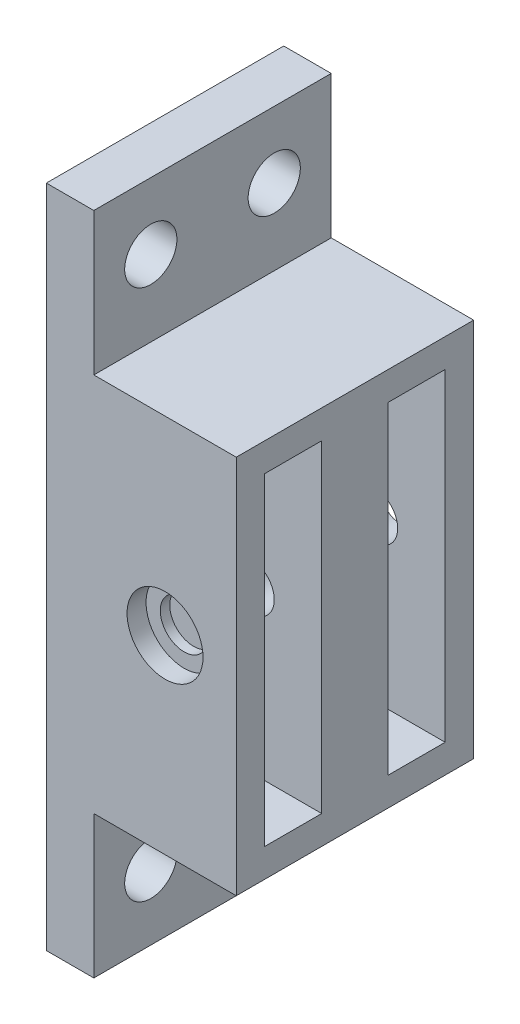
ISO-10303-21;
HEADER;
FILE_DESCRIPTION(('STEP AP214'),'2;1');
FILE_NAME('part.step','',(''),(''),'','','');
FILE_SCHEMA(('AUTOMOTIVE_DESIGN { 1 0 10303 214 1 1 1 1 }'));
ENDSEC;
DATA;
#1=APPLICATION_CONTEXT('core data for automotive mechanical design processes');
#2=APPLICATION_PROTOCOL_DEFINITION('international standard','automotive_design',2000,#1);
#3=PRODUCT_CONTEXT('',#1,'mechanical');
#4=PRODUCT('Part','Part','',(#3));
#5=PRODUCT_RELATED_PRODUCT_CATEGORY('part','',(#4));
#6=PRODUCT_DEFINITION_FORMATION('','',#4);
#7=PRODUCT_DEFINITION_CONTEXT('part definition',#1,'design');
#8=PRODUCT_DEFINITION('design','',#6,#7);
#9=PRODUCT_DEFINITION_SHAPE('','',#8);
#10=(LENGTH_UNIT() NAMED_UNIT(*) SI_UNIT(.MILLI.,.METRE.));
#11=(NAMED_UNIT(*) PLANE_ANGLE_UNIT() SI_UNIT($,.RADIAN.));
#12=(NAMED_UNIT(*) SI_UNIT($,.STERADIAN.) SOLID_ANGLE_UNIT());
#13=UNCERTAINTY_MEASURE_WITH_UNIT(LENGTH_MEASURE(1.E-05),#10,'distance_accuracy_value','');
#14=(GEOMETRIC_REPRESENTATION_CONTEXT(3) GLOBAL_UNCERTAINTY_ASSIGNED_CONTEXT((#13)) GLOBAL_UNIT_ASSIGNED_CONTEXT((#10,
#11,#12)) REPRESENTATION_CONTEXT('',''));
#15=CARTESIAN_POINT('',(0.,0.,0.));
#16=DIRECTION('',(0.,0.,1.));
#17=DIRECTION('',(1.,0.,0.));
#18=AXIS2_PLACEMENT_3D('',#15,#16,#17);
#19=CARTESIAN_POINT('',(5.,0.,0.));
#20=DIRECTION('',(1.,0.,0.));
#21=DIRECTION('',(0.,0.,-1.));
#22=AXIS2_PLACEMENT_3D('',#19,#20,#21);
#23=PLANE('',#22);
#24=DIRECTION('',(0.,0.,1.));
#25=VECTOR('',#24,1.);
#26=CARTESIAN_POINT('',(5.,36.3888036859797,-20.3200373764248));
#27=LINE('',#26,#25);
#28=CARTESIAN_POINT('',(5.,36.3888036859797,-45.3200373764248));
#29=VERTEX_POINT('',#28);
#30=CARTESIAN_POINT('',(5.,36.3888036859797,-20.3200373764248));
#31=VERTEX_POINT('',#30);
#32=EDGE_CURVE('E262',#29,#31,#27,.T.);
#33=ORIENTED_EDGE('',*,*,#32,.F.);
#34=DIRECTION('',(0.,1.,0.));
#35=VECTOR('',#34,1.);
#36=CARTESIAN_POINT('',(5.,51.3888036859797,-45.3200373764248));
#37=LINE('',#36,#35);
#38=CARTESIAN_POINT('',(5.,51.3888036859797,-45.3200373764248));
#39=VERTEX_POINT('',#38);
#40=EDGE_CURVE('E335',#29,#39,#37,.T.);
#41=ORIENTED_EDGE('',*,*,#40,.T.);
#42=DIRECTION('',(0.,0.,1.));
#43=VECTOR('',#42,1.);
#44=CARTESIAN_POINT('',(5.,51.3888036859797,-20.3200373764248));
#45=LINE('',#44,#43);
#46=CARTESIAN_POINT('',(5.,51.3888036859797,-20.3200373764248));
#47=VERTEX_POINT('',#46);
#48=EDGE_CURVE('E332',#39,#47,#45,.T.);
#49=ORIENTED_EDGE('',*,*,#48,.T.);
#50=DIRECTION('',(0.,-1.,0.));
#51=VECTOR('',#50,1.);
#52=CARTESIAN_POINT('',(5.,51.3888036859797,-20.3200373764248));
#53=LINE('',#52,#51);
#54=EDGE_CURVE('E337',#47,#31,#53,.T.);
#55=ORIENTED_EDGE('',*,*,#54,.T.);
#56=EDGE_LOOP('',(#33,#41,#49,#55));
#57=FACE_BOUND('',#56,.T.);
#58=CARTESIAN_POINT('',(5.,44.3888036859797,-39.3200373764248));
#59=DIRECTION('',(1.,0.,0.));
#60=DIRECTION('',(0.,0.,-1.));
#61=AXIS2_PLACEMENT_3D('',#58,#59,#60);
#62=CIRCLE('',#61,2.75);
#63=CARTESIAN_POINT('',(5.,44.3888036859797,-42.0700373764248));
#64=VERTEX_POINT('',#63);
#65=EDGE_CURVE('E315',#64,#64,#62,.T.);
#66=ORIENTED_EDGE('',*,*,#65,.F.);
#67=EDGE_LOOP('',(#66));
#68=FACE_BOUND('',#67,.T.);
#69=CARTESIAN_POINT('',(5.,44.3888036859797,-26.3200373764248));
#70=DIRECTION('',(1.,0.,0.));
#71=DIRECTION('',(0.,0.,-1.));
#72=AXIS2_PLACEMENT_3D('',#69,#70,#71);
#73=CIRCLE('',#72,2.75);
#74=CARTESIAN_POINT('',(5.,44.3888036859797,-29.0700373764248));
#75=VERTEX_POINT('',#74);
#76=EDGE_CURVE('E319',#75,#75,#73,.T.);
#77=ORIENTED_EDGE('',*,*,#76,.F.);
#78=EDGE_LOOP('',(#77));
#79=FACE_BOUND('',#78,.T.);
#80=ADVANCED_FACE('F44',(#57,#68,#79),#23,.T.);
#81=DIRECTION('',(0.,0.,-1.));
#82=VECTOR('',#81,1.);
#83=CARTESIAN_POINT('',(5.,-3.61119631402033,-20.3200373764248));
#84=LINE('',#83,#82);
#85=CARTESIAN_POINT('',(5.,-3.61119631402033,-20.3200373764248));
#86=VERTEX_POINT('',#85);
#87=CARTESIAN_POINT('',(5.,-3.61119631402033,-45.3200373764248));
#88=VERTEX_POINT('',#87);
#89=EDGE_CURVE('E211',#86,#88,#84,.T.);
#90=ORIENTED_EDGE('',*,*,#89,.F.);
#91=CARTESIAN_POINT('',(5.,-18.6111963140203,-20.3200373764248));
#92=VERTEX_POINT('',#91);
#93=EDGE_CURVE('E333',#86,#92,#53,.T.);
#94=ORIENTED_EDGE('',*,*,#93,.T.);
#95=DIRECTION('',(0.,0.,-1.));
#96=VECTOR('',#95,1.);
#97=CARTESIAN_POINT('',(5.,-18.6111963140203,-20.3200373764248));
#98=LINE('',#97,#96);
#99=CARTESIAN_POINT('',(5.,-18.6111963140203,-45.3200373764248));
#100=VERTEX_POINT('',#99);
#101=EDGE_CURVE('E336',#92,#100,#98,.T.);
#102=ORIENTED_EDGE('',*,*,#101,.T.);
#103=EDGE_CURVE('E327',#100,#88,#37,.T.);
#104=ORIENTED_EDGE('',*,*,#103,.T.);
#105=EDGE_LOOP('',(#90,#94,#102,#104));
#106=FACE_BOUND('',#105,.T.);
#107=CARTESIAN_POINT('',(5.,-11.6111963140203,-26.3200373764248));
#108=DIRECTION('',(1.,0.,0.));
#109=DIRECTION('',(0.,0.,-1.));
#110=AXIS2_PLACEMENT_3D('',#107,#108,#109);
#111=CIRCLE('',#110,2.74999999999999);
#112=CARTESIAN_POINT('',(5.,-11.6111963140203,-29.0700373764248));
#113=VERTEX_POINT('',#112);
#114=EDGE_CURVE('E302',#113,#113,#111,.T.);
#115=ORIENTED_EDGE('',*,*,#114,.F.);
#116=EDGE_LOOP('',(#115));
#117=FACE_BOUND('',#116,.T.);
#118=CARTESIAN_POINT('',(5.,-11.6111963140203,-39.3200373764248));
#119=DIRECTION('',(1.,0.,0.));
#120=DIRECTION('',(0.,0.,-1.));
#121=AXIS2_PLACEMENT_3D('',#118,#119,#120);
#122=CIRCLE('',#121,2.74999999999999);
#123=CARTESIAN_POINT('',(5.,-11.6111963140203,-42.0700373764248));
#124=VERTEX_POINT('',#123);
#125=EDGE_CURVE('E297',#124,#124,#122,.T.);
#126=ORIENTED_EDGE('',*,*,#125,.F.);
#127=EDGE_LOOP('',(#126));
#128=FACE_BOUND('',#127,.T.);
#129=ADVANCED_FACE('F387',(#106,#117,#128),#23,.T.);
#130=CARTESIAN_POINT('',(0.,0.,0.));
#131=DIRECTION('',(1.,0.,0.));
#132=DIRECTION('',(0.,0.,-1.));
#133=AXIS2_PLACEMENT_3D('',#130,#131,#132);
#134=PLANE('',#133);
#135=DIRECTION('',(0.,0.,1.));
#136=VECTOR('',#135,1.);
#137=CARTESIAN_POINT('',(0.,33.3888036859797,-23.3200373764248));
#138=LINE('',#137,#136);
#139=CARTESIAN_POINT('',(0.,33.3888036859797,-29.3200373764248));
#140=VERTEX_POINT('',#139);
#141=CARTESIAN_POINT('',(0.,33.3888036859797,-23.3200373764248));
#142=VERTEX_POINT('',#141);
#143=EDGE_CURVE('E174',#140,#142,#138,.T.);
#144=ORIENTED_EDGE('',*,*,#143,.T.);
#145=DIRECTION('',(0.,-1.,0.));
#146=VECTOR('',#145,1.);
#147=CARTESIAN_POINT('',(0.,33.3888036859797,-23.3200373764248));
#148=LINE('',#147,#146);
#149=CARTESIAN_POINT('',(0.,-0.611196314020332,-23.3200373764248));
#150=VERTEX_POINT('',#149);
#151=EDGE_CURVE('E163',#142,#150,#148,.T.);
#152=ORIENTED_EDGE('',*,*,#151,.T.);
#153=DIRECTION('',(0.,0.,-1.));
#154=VECTOR('',#153,1.);
#155=CARTESIAN_POINT('',(0.,-0.611196314020332,-23.3200373764248));
#156=LINE('',#155,#154);
#157=CARTESIAN_POINT('',(0.,-0.611196314020332,-29.3200373764248));
#158=VERTEX_POINT('',#157);
#159=EDGE_CURVE('E178',#150,#158,#156,.T.);
#160=ORIENTED_EDGE('',*,*,#159,.T.);
#161=DIRECTION('',(0.,1.,0.));
#162=VECTOR('',#161,1.);
#163=CARTESIAN_POINT('',(0.,33.3888036859797,-29.3200373764248));
#164=LINE('',#163,#162);
#165=EDGE_CURVE('E65',#158,#140,#164,.T.);
#166=ORIENTED_EDGE('',*,*,#165,.T.);
#167=EDGE_LOOP('',(#144,#152,#160,#166));
#168=FACE_BOUND('',#167,.T.);
#169=DIRECTION('',(0.,0.,1.));
#170=VECTOR('',#169,1.);
#171=CARTESIAN_POINT('',(0.,33.3888036859797,-36.3200373764248));
#172=LINE('',#171,#170);
#173=CARTESIAN_POINT('',(0.,33.3888036859797,-42.3200373764248));
#174=VERTEX_POINT('',#173);
#175=CARTESIAN_POINT('',(0.,33.3888036859797,-36.3200373764248));
#176=VERTEX_POINT('',#175);
#177=EDGE_CURVE('E222',#174,#176,#172,.T.);
#178=ORIENTED_EDGE('',*,*,#177,.T.);
#179=DIRECTION('',(0.,-1.,0.));
#180=VECTOR('',#179,1.);
#181=CARTESIAN_POINT('',(0.,33.3888036859797,-36.3200373764248));
#182=LINE('',#181,#180);
#183=CARTESIAN_POINT('',(0.,-0.611196314020332,-36.3200373764248));
#184=VERTEX_POINT('',#183);
#185=EDGE_CURVE('E240',#176,#184,#182,.T.);
#186=ORIENTED_EDGE('',*,*,#185,.T.);
#187=DIRECTION('',(0.,0.,-1.));
#188=VECTOR('',#187,1.);
#189=CARTESIAN_POINT('',(0.,-0.611196314020332,-36.3200373764248));
#190=LINE('',#189,#188);
#191=CARTESIAN_POINT('',(0.,-0.611196314020332,-42.3200373764248));
#192=VERTEX_POINT('',#191);
#193=EDGE_CURVE('E252',#184,#192,#190,.T.);
#194=ORIENTED_EDGE('',*,*,#193,.T.);
#195=DIRECTION('',(0.,1.,0.));
#196=VECTOR('',#195,1.);
#197=CARTESIAN_POINT('',(0.,33.3888036859797,-42.3200373764248));
#198=LINE('',#197,#196);
#199=EDGE_CURVE('E69',#192,#174,#198,.T.);
#200=ORIENTED_EDGE('',*,*,#199,.T.);
#201=EDGE_LOOP('',(#178,#186,#194,#200));
#202=FACE_BOUND('',#201,.T.);
#203=DIRECTION('',(0.,1.,0.));
#204=VECTOR('',#203,1.);
#205=CARTESIAN_POINT('',(0.,51.3888036859797,-45.3200373764248));
#206=LINE('',#205,#204);
#207=CARTESIAN_POINT('',(0.,-18.6111963140203,-45.3200373764248));
#208=VERTEX_POINT('',#207);
#209=CARTESIAN_POINT('',(0.,51.3888036859797,-45.3200373764248));
#210=VERTEX_POINT('',#209);
#211=EDGE_CURVE('E322',#208,#210,#206,.T.);
#212=ORIENTED_EDGE('',*,*,#211,.F.);
#213=DIRECTION('',(0.,0.,-1.));
#214=VECTOR('',#213,1.);
#215=CARTESIAN_POINT('',(0.,-18.6111963140203,-20.3200373764248));
#216=LINE('',#215,#214);
#217=CARTESIAN_POINT('',(0.,-18.6111963140203,-20.3200373764248));
#218=VERTEX_POINT('',#217);
#219=EDGE_CURVE('E355',#218,#208,#216,.T.);
#220=ORIENTED_EDGE('',*,*,#219,.F.);
#221=DIRECTION('',(0.,-1.,0.));
#222=VECTOR('',#221,1.);
#223=CARTESIAN_POINT('',(0.,51.3888036859797,-20.3200373764248));
#224=LINE('',#223,#222);
#225=CARTESIAN_POINT('',(0.,51.3888036859797,-20.3200373764248));
#226=VERTEX_POINT('',#225);
#227=EDGE_CURVE('E349',#226,#218,#224,.T.);
#228=ORIENTED_EDGE('',*,*,#227,.F.);
#229=DIRECTION('',(0.,0.,1.));
#230=VECTOR('',#229,1.);
#231=CARTESIAN_POINT('',(0.,51.3888036859797,-20.3200373764248));
#232=LINE('',#231,#230);
#233=EDGE_CURVE('E347',#210,#226,#232,.T.);
#234=ORIENTED_EDGE('',*,*,#233,.F.);
#235=EDGE_LOOP('',(#212,#220,#228,#234));
#236=FACE_BOUND('',#235,.T.);
#237=CARTESIAN_POINT('',(0.,44.3888036859797,-26.3200373764248));
#238=DIRECTION('',(1.,0.,0.));
#239=DIRECTION('',(0.,0.,-1.));
#240=AXIS2_PLACEMENT_3D('',#237,#238,#239);
#241=CIRCLE('',#240,2.75);
#242=CARTESIAN_POINT('',(0.,44.3888036859797,-29.0700373764248));
#243=VERTEX_POINT('',#242);
#244=EDGE_CURVE('E316',#243,#243,#241,.T.);
#245=ORIENTED_EDGE('',*,*,#244,.T.);
#246=EDGE_LOOP('',(#245));
#247=FACE_BOUND('',#246,.T.);
#248=CARTESIAN_POINT('',(0.,44.3888036859797,-39.3200373764248));
#249=DIRECTION('',(1.,0.,0.));
#250=DIRECTION('',(0.,0.,-1.));
#251=AXIS2_PLACEMENT_3D('',#248,#249,#250);
#252=CIRCLE('',#251,2.75);
#253=CARTESIAN_POINT('',(0.,44.3888036859797,-42.0700373764248));
#254=VERTEX_POINT('',#253);
#255=EDGE_CURVE('E306',#254,#254,#252,.T.);
#256=ORIENTED_EDGE('',*,*,#255,.T.);
#257=EDGE_LOOP('',(#256));
#258=FACE_BOUND('',#257,.T.);
#259=CARTESIAN_POINT('',(0.,-11.6111963140203,-26.3200373764248));
#260=DIRECTION('',(1.,0.,0.));
#261=DIRECTION('',(0.,0.,-1.));
#262=AXIS2_PLACEMENT_3D('',#259,#260,#261);
#263=CIRCLE('',#262,2.74999999999999);
#264=CARTESIAN_POINT('',(0.,-11.6111963140203,-29.0700373764248));
#265=VERTEX_POINT('',#264);
#266=EDGE_CURVE('E298',#265,#265,#263,.T.);
#267=ORIENTED_EDGE('',*,*,#266,.T.);
#268=EDGE_LOOP('',(#267));
#269=FACE_BOUND('',#268,.T.);
#270=CARTESIAN_POINT('',(0.,-11.6111963140203,-39.3200373764248));
#271=DIRECTION('',(1.,0.,0.));
#272=DIRECTION('',(0.,0.,-1.));
#273=AXIS2_PLACEMENT_3D('',#270,#271,#272);
#274=CIRCLE('',#273,2.74999999999999);
#275=CARTESIAN_POINT('',(0.,-11.6111963140203,-42.0700373764248));
#276=VERTEX_POINT('',#275);
#277=EDGE_CURVE('E293',#276,#276,#274,.T.);
#278=ORIENTED_EDGE('',*,*,#277,.T.);
#279=EDGE_LOOP('',(#278));
#280=FACE_BOUND('',#279,.T.);
#281=ADVANCED_FACE('F182',(#168,#202,#236,#247,#258,#269,#280),#134,.F.);
#282=CARTESIAN_POINT('',(5.,51.3888036859797,-45.3200373764248));
#283=DIRECTION('',(0.,0.,1.));
#284=DIRECTION('',(0.,-1.,0.));
#285=AXIS2_PLACEMENT_3D('',#282,#283,#284);
#286=PLANE('',#285);
#287=CARTESIAN_POINT('',(12.5,16.3888036859797,-45.3200373764248));
#288=DIRECTION('',(0.,0.,1.));
#289=DIRECTION('',(1.,0.,0.));
#290=AXIS2_PLACEMENT_3D('',#287,#288,#289);
#291=CIRCLE('',#290,2.5);
#292=CARTESIAN_POINT('',(15.,16.3888036859797,-45.3200373764248));
#293=VERTEX_POINT('',#292);
#294=EDGE_CURVE('E513',#293,#293,#291,.T.);
#295=ORIENTED_EDGE('',*,*,#294,.T.);
#296=EDGE_LOOP('',(#295));
#297=FACE_BOUND('',#296,.T.);
#298=ORIENTED_EDGE('',*,*,#211,.T.);
#299=DIRECTION('',(-1.,0.,0.));
#300=VECTOR('',#299,1.);
#301=CARTESIAN_POINT('',(5.,51.3888036859797,-45.3200373764248));
#302=LINE('',#301,#300);
#303=EDGE_CURVE('E11',#39,#210,#302,.T.);
#304=ORIENTED_EDGE('',*,*,#303,.F.);
#305=ORIENTED_EDGE('',*,*,#40,.F.);
#306=DIRECTION('',(-1.,0.,0.));
#307=VECTOR('',#306,1.);
#308=CARTESIAN_POINT('',(20.,36.3888036859797,-45.3200373764248));
#309=LINE('',#308,#307);
#310=CARTESIAN_POINT('',(20.,36.3888036859797,-45.3200373764248));
#311=VERTEX_POINT('',#310);
#312=EDGE_CURVE('E284',#311,#29,#309,.T.);
#313=ORIENTED_EDGE('',*,*,#312,.F.);
#314=DIRECTION('',(0.,1.,0.));
#315=VECTOR('',#314,1.);
#316=CARTESIAN_POINT('',(20.,36.3888036859797,-45.3200373764248));
#317=LINE('',#316,#315);
#318=CARTESIAN_POINT('',(20.,-3.61119631402033,-45.3200373764248));
#319=VERTEX_POINT('',#318);
#320=EDGE_CURVE('E270',#319,#311,#317,.T.);
#321=ORIENTED_EDGE('',*,*,#320,.F.);
#322=DIRECTION('',(-1.,0.,0.));
#323=VECTOR('',#322,1.);
#324=CARTESIAN_POINT('',(20.,-3.61119631402033,-45.3200373764248));
#325=LINE('',#324,#323);
#326=EDGE_CURVE('E290',#319,#88,#325,.T.);
#327=ORIENTED_EDGE('',*,*,#326,.T.);
#328=ORIENTED_EDGE('',*,*,#103,.F.);
#329=DIRECTION('',(-1.,0.,0.));
#330=VECTOR('',#329,1.);
#331=CARTESIAN_POINT('',(5.,-18.6111963140203,-45.3200373764248));
#332=LINE('',#331,#330);
#333=EDGE_CURVE('E345',#100,#208,#332,.T.);
#334=ORIENTED_EDGE('',*,*,#333,.T.);
#335=EDGE_LOOP('',(#298,#304,#305,#313,#321,#327,#328,#334));
#336=FACE_BOUND('',#335,.T.);
#337=ADVANCED_FACE('F50',(#297,#336),#286,.F.);
#338=CARTESIAN_POINT('',(5.,51.3888036859797,-20.3200373764248));
#339=DIRECTION('',(0.,-1.,0.));
#340=DIRECTION('',(0.,0.,-1.));
#341=AXIS2_PLACEMENT_3D('',#338,#339,#340);
#342=PLANE('',#341);
#343=ORIENTED_EDGE('',*,*,#233,.T.);
#344=DIRECTION('',(-1.,0.,0.));
#345=VECTOR('',#344,1.);
#346=CARTESIAN_POINT('',(5.,51.3888036859797,-20.3200373764248));
#347=LINE('',#346,#345);
#348=EDGE_CURVE('E54',#47,#226,#347,.T.);
#349=ORIENTED_EDGE('',*,*,#348,.F.);
#350=ORIENTED_EDGE('',*,*,#48,.F.);
#351=ORIENTED_EDGE('',*,*,#303,.T.);
#352=EDGE_LOOP('',(#343,#349,#350,#351));
#353=FACE_BOUND('',#352,.T.);
#354=ADVANCED_FACE('F397',(#353),#342,.F.);
#355=CARTESIAN_POINT('',(5.,51.3888036859797,-20.3200373764248));
#356=DIRECTION('',(0.,0.,-1.));
#357=DIRECTION('',(0.,1.,0.));
#358=AXIS2_PLACEMENT_3D('',#355,#356,#357);
#359=PLANE('',#358);
#360=CARTESIAN_POINT('',(12.5,16.3888036859797,-20.3200373764248));
#361=DIRECTION('',(0.,0.,1.));
#362=DIRECTION('',(1.,0.,0.));
#363=AXIS2_PLACEMENT_3D('',#360,#361,#362);
#364=CIRCLE('',#363,4.);
#365=CARTESIAN_POINT('',(16.5,16.3888036859797,-20.3200373764248));
#366=VERTEX_POINT('',#365);
#367=EDGE_CURVE('E195',#366,#366,#364,.T.);
#368=ORIENTED_EDGE('',*,*,#367,.F.);
#369=EDGE_LOOP('',(#368));
#370=FACE_BOUND('',#369,.T.);
#371=ORIENTED_EDGE('',*,*,#227,.T.);
#372=DIRECTION('',(-1.,0.,0.));
#373=VECTOR('',#372,1.);
#374=CARTESIAN_POINT('',(5.,-18.6111963140203,-20.3200373764248));
#375=LINE('',#374,#373);
#376=EDGE_CURVE('E356',#92,#218,#375,.T.);
#377=ORIENTED_EDGE('',*,*,#376,.F.);
#378=ORIENTED_EDGE('',*,*,#93,.F.);
#379=DIRECTION('',(-1.,0.,0.));
#380=VECTOR('',#379,1.);
#381=CARTESIAN_POINT('',(20.,-3.61119631402033,-20.3200373764248));
#382=LINE('',#381,#380);
#383=CARTESIAN_POINT('',(20.,-3.61119631402033,-20.3200373764248));
#384=VERTEX_POINT('',#383);
#385=EDGE_CURVE('E292',#384,#86,#382,.T.);
#386=ORIENTED_EDGE('',*,*,#385,.F.);
#387=DIRECTION('',(0.,-1.,0.));
#388=VECTOR('',#387,1.);
#389=CARTESIAN_POINT('',(20.,36.3888036859797,-20.3200373764248));
#390=LINE('',#389,#388);
#391=CARTESIAN_POINT('',(20.,36.3888036859797,-20.3200373764248));
#392=VERTEX_POINT('',#391);
#393=EDGE_CURVE('E259',#392,#384,#390,.T.);
#394=ORIENTED_EDGE('',*,*,#393,.F.);
#395=DIRECTION('',(-1.,0.,0.));
#396=VECTOR('',#395,1.);
#397=CARTESIAN_POINT('',(20.,36.3888036859797,-20.3200373764248));
#398=LINE('',#397,#396);
#399=EDGE_CURVE('E272',#392,#31,#398,.T.);
#400=ORIENTED_EDGE('',*,*,#399,.T.);
#401=ORIENTED_EDGE('',*,*,#54,.F.);
#402=ORIENTED_EDGE('',*,*,#348,.T.);
#403=EDGE_LOOP('',(#371,#377,#378,#386,#394,#400,#401,#402));
#404=FACE_BOUND('',#403,.T.);
#405=ADVANCED_FACE('F366',(#370,#404),#359,.F.);
#406=CARTESIAN_POINT('',(5.,-18.6111963140203,-20.3200373764248));
#407=DIRECTION('',(0.,1.,0.));
#408=DIRECTION('',(0.,0.,1.));
#409=AXIS2_PLACEMENT_3D('',#406,#407,#408);
#410=PLANE('',#409);
#411=ORIENTED_EDGE('',*,*,#219,.T.);
#412=ORIENTED_EDGE('',*,*,#333,.F.);
#413=ORIENTED_EDGE('',*,*,#101,.F.);
#414=ORIENTED_EDGE('',*,*,#376,.T.);
#415=EDGE_LOOP('',(#411,#412,#413,#414));
#416=FACE_BOUND('',#415,.T.);
#417=ADVANCED_FACE('F378',(#416),#410,.F.);
#418=CARTESIAN_POINT('',(5.,44.3888036859797,-26.3200373764248));
#419=DIRECTION('',(-1.,0.,0.));
#420=DIRECTION('',(0.,0.,1.));
#421=AXIS2_PLACEMENT_3D('',#418,#419,#420);
#422=CYLINDRICAL_SURFACE('',#421,2.75);
#423=ORIENTED_EDGE('',*,*,#76,.T.);
#424=EDGE_LOOP('',(#423));
#425=FACE_BOUND('',#424,.T.);
#426=ORIENTED_EDGE('',*,*,#244,.F.);
#427=EDGE_LOOP('',(#426));
#428=FACE_BOUND('',#427,.T.);
#429=ADVANCED_FACE('F417',(#425,#428),#422,.F.);
#430=CARTESIAN_POINT('',(5.,44.3888036859797,-39.3200373764248));
#431=DIRECTION('',(-1.,0.,0.));
#432=DIRECTION('',(0.,0.,1.));
#433=AXIS2_PLACEMENT_3D('',#430,#431,#432);
#434=CYLINDRICAL_SURFACE('',#433,2.75);
#435=ORIENTED_EDGE('',*,*,#65,.T.);
#436=EDGE_LOOP('',(#435));
#437=FACE_BOUND('',#436,.T.);
#438=ORIENTED_EDGE('',*,*,#255,.F.);
#439=EDGE_LOOP('',(#438));
#440=FACE_BOUND('',#439,.T.);
#441=ADVANCED_FACE('F424',(#437,#440),#434,.F.);
#442=CARTESIAN_POINT('',(5.,-11.6111963140203,-26.3200373764248));
#443=DIRECTION('',(-1.,0.,0.));
#444=DIRECTION('',(0.,0.,1.));
#445=AXIS2_PLACEMENT_3D('',#442,#443,#444);
#446=CYLINDRICAL_SURFACE('',#445,2.74999999999999);
#447=ORIENTED_EDGE('',*,*,#114,.T.);
#448=EDGE_LOOP('',(#447));
#449=FACE_BOUND('',#448,.T.);
#450=ORIENTED_EDGE('',*,*,#266,.F.);
#451=EDGE_LOOP('',(#450));
#452=FACE_BOUND('',#451,.T.);
#453=ADVANCED_FACE('F427',(#449,#452),#446,.F.);
#454=CARTESIAN_POINT('',(5.,-11.6111963140203,-39.3200373764248));
#455=DIRECTION('',(-1.,0.,0.));
#456=DIRECTION('',(0.,0.,1.));
#457=AXIS2_PLACEMENT_3D('',#454,#455,#456);
#458=CYLINDRICAL_SURFACE('',#457,2.74999999999999);
#459=ORIENTED_EDGE('',*,*,#125,.T.);
#460=EDGE_LOOP('',(#459));
#461=FACE_BOUND('',#460,.T.);
#462=ORIENTED_EDGE('',*,*,#277,.F.);
#463=EDGE_LOOP('',(#462));
#464=FACE_BOUND('',#463,.T.);
#465=ADVANCED_FACE('F442',(#461,#464),#458,.F.);
#466=CARTESIAN_POINT('',(20.,-3.61119631402033,-20.3200373764248));
#467=DIRECTION('',(0.,1.,0.));
#468=DIRECTION('',(0.,0.,1.));
#469=AXIS2_PLACEMENT_3D('',#466,#467,#468);
#470=PLANE('',#469);
#471=ORIENTED_EDGE('',*,*,#89,.T.);
#472=ORIENTED_EDGE('',*,*,#326,.F.);
#473=DIRECTION('',(0.,0.,-1.));
#474=VECTOR('',#473,1.);
#475=CARTESIAN_POINT('',(20.,-3.61119631402033,-20.3200373764248));
#476=LINE('',#475,#474);
#477=EDGE_CURVE('E263',#384,#319,#476,.T.);
#478=ORIENTED_EDGE('',*,*,#477,.F.);
#479=ORIENTED_EDGE('',*,*,#385,.T.);
#480=EDGE_LOOP('',(#471,#472,#478,#479));
#481=FACE_BOUND('',#480,.T.);
#482=ADVANCED_FACE('F388',(#481),#470,.F.);
#483=CARTESIAN_POINT('',(20.,36.3888036859797,-20.3200373764248));
#484=DIRECTION('',(0.,-1.,0.));
#485=DIRECTION('',(0.,0.,-1.));
#486=AXIS2_PLACEMENT_3D('',#483,#484,#485);
#487=PLANE('',#486);
#488=ORIENTED_EDGE('',*,*,#32,.T.);
#489=ORIENTED_EDGE('',*,*,#399,.F.);
#490=DIRECTION('',(0.,0.,1.));
#491=VECTOR('',#490,1.);
#492=CARTESIAN_POINT('',(20.,36.3888036859797,-20.3200373764248));
#493=LINE('',#492,#491);
#494=EDGE_CURVE('E269',#311,#392,#493,.T.);
#495=ORIENTED_EDGE('',*,*,#494,.F.);
#496=ORIENTED_EDGE('',*,*,#312,.T.);
#497=EDGE_LOOP('',(#488,#489,#495,#496));
#498=FACE_BOUND('',#497,.T.);
#499=ADVANCED_FACE('F449',(#498),#487,.F.);
#500=CARTESIAN_POINT('',(20.,0.,0.));
#501=DIRECTION('',(1.,0.,0.));
#502=DIRECTION('',(0.,0.,-1.));
#503=AXIS2_PLACEMENT_3D('',#500,#501,#502);
#504=PLANE('',#503);
#505=DIRECTION('',(0.,-1.,0.));
#506=VECTOR('',#505,1.);
#507=CARTESIAN_POINT('',(20.,33.3888036859797,-23.3200373764248));
#508=LINE('',#507,#506);
#509=CARTESIAN_POINT('',(20.,33.3888036859797,-23.3200373764248));
#510=VERTEX_POINT('',#509);
#511=CARTESIAN_POINT('',(20.,-0.611196314020332,-23.3200373764248));
#512=VERTEX_POINT('',#511);
#513=EDGE_CURVE('E170',#510,#512,#508,.T.);
#514=ORIENTED_EDGE('',*,*,#513,.F.);
#515=DIRECTION('',(0.,0.,1.));
#516=VECTOR('',#515,1.);
#517=CARTESIAN_POINT('',(20.,33.3888036859797,-23.3200373764248));
#518=LINE('',#517,#516);
#519=CARTESIAN_POINT('',(20.,33.3888036859797,-29.3200373764248));
#520=VERTEX_POINT('',#519);
#521=EDGE_CURVE('E183',#520,#510,#518,.T.);
#522=ORIENTED_EDGE('',*,*,#521,.F.);
#523=DIRECTION('',(0.,1.,0.));
#524=VECTOR('',#523,1.);
#525=CARTESIAN_POINT('',(20.,33.3888036859797,-29.3200373764248));
#526=LINE('',#525,#524);
#527=CARTESIAN_POINT('',(20.,-0.611196314020332,-29.3200373764248));
#528=VERTEX_POINT('',#527);
#529=EDGE_CURVE('E186',#528,#520,#526,.T.);
#530=ORIENTED_EDGE('',*,*,#529,.F.);
#531=DIRECTION('',(0.,0.,-1.));
#532=VECTOR('',#531,1.);
#533=CARTESIAN_POINT('',(20.,-0.611196314020332,-23.3200373764248));
#534=LINE('',#533,#532);
#535=EDGE_CURVE('E203',#512,#528,#534,.T.);
#536=ORIENTED_EDGE('',*,*,#535,.F.);
#537=EDGE_LOOP('',(#514,#522,#530,#536));
#538=FACE_BOUND('',#537,.T.);
#539=DIRECTION('',(0.,-1.,0.));
#540=VECTOR('',#539,1.);
#541=CARTESIAN_POINT('',(20.,33.3888036859797,-36.3200373764248));
#542=LINE('',#541,#540);
#543=CARTESIAN_POINT('',(20.,33.3888036859797,-36.3200373764248));
#544=VERTEX_POINT('',#543);
#545=CARTESIAN_POINT('',(20.,-0.611196314020332,-36.3200373764248));
#546=VERTEX_POINT('',#545);
#547=EDGE_CURVE('E205',#544,#546,#542,.T.);
#548=ORIENTED_EDGE('',*,*,#547,.F.);
#549=DIRECTION('',(0.,0.,1.));
#550=VECTOR('',#549,1.);
#551=CARTESIAN_POINT('',(20.,33.3888036859797,-36.3200373764248));
#552=LINE('',#551,#550);
#553=CARTESIAN_POINT('',(20.,33.3888036859797,-42.3200373764248));
#554=VERTEX_POINT('',#553);
#555=EDGE_CURVE('E235',#554,#544,#552,.T.);
#556=ORIENTED_EDGE('',*,*,#555,.F.);
#557=DIRECTION('',(0.,1.,0.));
#558=VECTOR('',#557,1.);
#559=CARTESIAN_POINT('',(20.,33.3888036859797,-42.3200373764248));
#560=LINE('',#559,#558);
#561=CARTESIAN_POINT('',(20.,-0.611196314020332,-42.3200373764248));
#562=VERTEX_POINT('',#561);
#563=EDGE_CURVE('E237',#562,#554,#560,.T.);
#564=ORIENTED_EDGE('',*,*,#563,.F.);
#565=DIRECTION('',(0.,0.,-1.));
#566=VECTOR('',#565,1.);
#567=CARTESIAN_POINT('',(20.,-0.611196314020332,-36.3200373764248));
#568=LINE('',#567,#566);
#569=EDGE_CURVE('E242',#546,#562,#568,.T.);
#570=ORIENTED_EDGE('',*,*,#569,.F.);
#571=EDGE_LOOP('',(#548,#556,#564,#570));
#572=FACE_BOUND('',#571,.T.);
#573=ORIENTED_EDGE('',*,*,#393,.T.);
#574=ORIENTED_EDGE('',*,*,#477,.T.);
#575=ORIENTED_EDGE('',*,*,#320,.T.);
#576=ORIENTED_EDGE('',*,*,#494,.T.);
#577=EDGE_LOOP('',(#573,#574,#575,#576));
#578=FACE_BOUND('',#577,.T.);
#579=ADVANCED_FACE('F454',(#538,#572,#578),#504,.T.);
#580=CARTESIAN_POINT('',(0.,33.3888036859797,-36.3200373764248));
#581=DIRECTION('',(0.,0.,1.));
#582=DIRECTION('',(0.,-1.,0.));
#583=AXIS2_PLACEMENT_3D('',#580,#581,#582);
#584=PLANE('',#583);
#585=CARTESIAN_POINT('',(12.5,16.3888036859797,-36.3200373764248));
#586=DIRECTION('',(0.,0.,1.));
#587=DIRECTION('',(0.,-1.,0.));
#588=AXIS2_PLACEMENT_3D('',#585,#586,#587);
#589=CIRCLE('',#588,2.5);
#590=CARTESIAN_POINT('',(12.5,13.8888036859797,-36.3200373764248));
#591=VERTEX_POINT('',#590);
#592=EDGE_CURVE('E518',#591,#591,#589,.T.);
#593=ORIENTED_EDGE('',*,*,#592,.T.);
#594=EDGE_LOOP('',(#593));
#595=FACE_BOUND('',#594,.T.);
#596=ORIENTED_EDGE('',*,*,#547,.T.);
#597=DIRECTION('',(1.,0.,0.));
#598=VECTOR('',#597,1.);
#599=CARTESIAN_POINT('',(0.,-0.611196314020332,-36.3200373764248));
#600=LINE('',#599,#598);
#601=EDGE_CURVE('E220',#184,#546,#600,.T.);
#602=ORIENTED_EDGE('',*,*,#601,.F.);
#603=ORIENTED_EDGE('',*,*,#185,.F.);
#604=DIRECTION('',(1.,0.,0.));
#605=VECTOR('',#604,1.);
#606=CARTESIAN_POINT('',(0.,33.3888036859797,-36.3200373764248));
#607=LINE('',#606,#605);
#608=EDGE_CURVE('E229',#176,#544,#607,.T.);
#609=ORIENTED_EDGE('',*,*,#608,.T.);
#610=EDGE_LOOP('',(#596,#602,#603,#609));
#611=FACE_BOUND('',#610,.T.);
#612=ADVANCED_FACE('F459',(#595,#611),#584,.F.);
#613=CARTESIAN_POINT('',(0.,33.3888036859797,-36.3200373764248));
#614=DIRECTION('',(0.,1.,0.));
#615=DIRECTION('',(0.,0.,1.));
#616=AXIS2_PLACEMENT_3D('',#613,#614,#615);
#617=PLANE('',#616);
#618=ORIENTED_EDGE('',*,*,#555,.T.);
#619=ORIENTED_EDGE('',*,*,#608,.F.);
#620=ORIENTED_EDGE('',*,*,#177,.F.);
#621=DIRECTION('',(1.,0.,0.));
#622=VECTOR('',#621,1.);
#623=CARTESIAN_POINT('',(0.,33.3888036859797,-42.3200373764248));
#624=LINE('',#623,#622);
#625=EDGE_CURVE('E223',#174,#554,#624,.T.);
#626=ORIENTED_EDGE('',*,*,#625,.T.);
#627=EDGE_LOOP('',(#618,#619,#620,#626));
#628=FACE_BOUND('',#627,.T.);
#629=ADVANCED_FACE('F462',(#628),#617,.F.);
#630=CARTESIAN_POINT('',(0.,33.3888036859797,-42.3200373764248));
#631=DIRECTION('',(0.,0.,-1.));
#632=DIRECTION('',(-1.,0.,0.));
#633=AXIS2_PLACEMENT_3D('',#630,#631,#632);
#634=PLANE('',#633);
#635=CARTESIAN_POINT('',(12.5,16.3888036859797,-42.3200373764248));
#636=DIRECTION('',(0.,0.,-1.));
#637=DIRECTION('',(-1.,0.,0.));
#638=AXIS2_PLACEMENT_3D('',#635,#636,#637);
#639=CIRCLE('',#638,2.5);
#640=CARTESIAN_POINT('',(10.,16.3888036859797,-42.3200373764248));
#641=VERTEX_POINT('',#640);
#642=EDGE_CURVE('E519',#641,#641,#639,.T.);
#643=ORIENTED_EDGE('',*,*,#642,.T.);
#644=EDGE_LOOP('',(#643));
#645=FACE_BOUND('',#644,.T.);
#646=ORIENTED_EDGE('',*,*,#563,.T.);
#647=ORIENTED_EDGE('',*,*,#625,.F.);
#648=ORIENTED_EDGE('',*,*,#199,.F.);
#649=DIRECTION('',(1.,0.,0.));
#650=VECTOR('',#649,1.);
#651=CARTESIAN_POINT('',(0.,-0.611196314020332,-42.3200373764248));
#652=LINE('',#651,#650);
#653=EDGE_CURVE('E225',#192,#562,#652,.T.);
#654=ORIENTED_EDGE('',*,*,#653,.T.);
#655=EDGE_LOOP('',(#646,#647,#648,#654));
#656=FACE_BOUND('',#655,.T.);
#657=ADVANCED_FACE('F461',(#645,#656),#634,.F.);
#658=CARTESIAN_POINT('',(0.,-0.611196314020332,-36.3200373764248));
#659=DIRECTION('',(0.,-1.,0.));
#660=DIRECTION('',(0.,0.,-1.));
#661=AXIS2_PLACEMENT_3D('',#658,#659,#660);
#662=PLANE('',#661);
#663=ORIENTED_EDGE('',*,*,#569,.T.);
#664=ORIENTED_EDGE('',*,*,#653,.F.);
#665=ORIENTED_EDGE('',*,*,#193,.F.);
#666=ORIENTED_EDGE('',*,*,#601,.T.);
#667=EDGE_LOOP('',(#663,#664,#665,#666));
#668=FACE_BOUND('',#667,.T.);
#669=ADVANCED_FACE('F466',(#668),#662,.F.);
#670=CARTESIAN_POINT('',(0.,33.3888036859797,-23.3200373764248));
#671=DIRECTION('',(0.,0.,1.));
#672=DIRECTION('',(1.,0.,0.));
#673=AXIS2_PLACEMENT_3D('',#670,#671,#672);
#674=PLANE('',#673);
#675=CARTESIAN_POINT('',(12.5,16.3888036859797,-23.3200373764248));
#676=DIRECTION('',(0.,0.,1.));
#677=DIRECTION('',(1.,0.,0.));
#678=AXIS2_PLACEMENT_3D('',#675,#676,#677);
#679=CIRCLE('',#678,2.5);
#680=CARTESIAN_POINT('',(15.,16.3888036859797,-23.3200373764248));
#681=VERTEX_POINT('',#680);
#682=EDGE_CURVE('E523',#681,#681,#679,.T.);
#683=ORIENTED_EDGE('',*,*,#682,.T.);
#684=EDGE_LOOP('',(#683));
#685=FACE_BOUND('',#684,.T.);
#686=ORIENTED_EDGE('',*,*,#513,.T.);
#687=DIRECTION('',(1.,0.,0.));
#688=VECTOR('',#687,1.);
#689=CARTESIAN_POINT('',(0.,-0.611196314020332,-23.3200373764248));
#690=LINE('',#689,#688);
#691=EDGE_CURVE('E159',#150,#512,#690,.T.);
#692=ORIENTED_EDGE('',*,*,#691,.F.);
#693=ORIENTED_EDGE('',*,*,#151,.F.);
#694=DIRECTION('',(1.,0.,0.));
#695=VECTOR('',#694,1.);
#696=CARTESIAN_POINT('',(0.,33.3888036859797,-23.3200373764248));
#697=LINE('',#696,#695);
#698=EDGE_CURVE('E208',#142,#510,#697,.T.);
#699=ORIENTED_EDGE('',*,*,#698,.T.);
#700=EDGE_LOOP('',(#686,#692,#693,#699));
#701=FACE_BOUND('',#700,.T.);
#702=ADVANCED_FACE('F165',(#685,#701),#674,.F.);
#703=CARTESIAN_POINT('',(0.,33.3888036859797,-23.3200373764248));
#704=DIRECTION('',(0.,1.,0.));
#705=DIRECTION('',(0.,0.,1.));
#706=AXIS2_PLACEMENT_3D('',#703,#704,#705);
#707=PLANE('',#706);
#708=ORIENTED_EDGE('',*,*,#521,.T.);
#709=ORIENTED_EDGE('',*,*,#698,.F.);
#710=ORIENTED_EDGE('',*,*,#143,.F.);
#711=DIRECTION('',(1.,0.,0.));
#712=VECTOR('',#711,1.);
#713=CARTESIAN_POINT('',(0.,33.3888036859797,-29.3200373764248));
#714=LINE('',#713,#712);
#715=EDGE_CURVE('E215',#140,#520,#714,.T.);
#716=ORIENTED_EDGE('',*,*,#715,.T.);
#717=EDGE_LOOP('',(#708,#709,#710,#716));
#718=FACE_BOUND('',#717,.T.);
#719=ADVANCED_FACE('F476',(#718),#707,.F.);
#720=CARTESIAN_POINT('',(0.,33.3888036859797,-29.3200373764248));
#721=DIRECTION('',(0.,0.,-1.));
#722=DIRECTION('',(0.,1.,0.));
#723=AXIS2_PLACEMENT_3D('',#720,#721,#722);
#724=PLANE('',#723);
#725=CARTESIAN_POINT('',(12.5,16.3888036859797,-29.3200373764248));
#726=DIRECTION('',(0.,0.,-1.));
#727=DIRECTION('',(0.,1.,0.));
#728=AXIS2_PLACEMENT_3D('',#725,#726,#727);
#729=CIRCLE('',#728,2.5);
#730=CARTESIAN_POINT('',(12.5,18.8888036859797,-29.3200373764248));
#731=VERTEX_POINT('',#730);
#732=EDGE_CURVE('E47',#731,#731,#729,.T.);
#733=ORIENTED_EDGE('',*,*,#732,.T.);
#734=EDGE_LOOP('',(#733));
#735=FACE_BOUND('',#734,.T.);
#736=ORIENTED_EDGE('',*,*,#529,.T.);
#737=ORIENTED_EDGE('',*,*,#715,.F.);
#738=ORIENTED_EDGE('',*,*,#165,.F.);
#739=DIRECTION('',(1.,0.,0.));
#740=VECTOR('',#739,1.);
#741=CARTESIAN_POINT('',(0.,-0.611196314020332,-29.3200373764248));
#742=LINE('',#741,#740);
#743=EDGE_CURVE('E175',#158,#528,#742,.T.);
#744=ORIENTED_EDGE('',*,*,#743,.T.);
#745=EDGE_LOOP('',(#736,#737,#738,#744));
#746=FACE_BOUND('',#745,.T.);
#747=ADVANCED_FACE('F483',(#735,#746),#724,.F.);
#748=CARTESIAN_POINT('',(0.,-0.611196314020332,-23.3200373764248));
#749=DIRECTION('',(0.,-1.,0.));
#750=DIRECTION('',(0.,0.,-1.));
#751=AXIS2_PLACEMENT_3D('',#748,#749,#750);
#752=PLANE('',#751);
#753=ORIENTED_EDGE('',*,*,#535,.T.);
#754=ORIENTED_EDGE('',*,*,#743,.F.);
#755=ORIENTED_EDGE('',*,*,#159,.F.);
#756=ORIENTED_EDGE('',*,*,#691,.T.);
#757=EDGE_LOOP('',(#753,#754,#755,#756));
#758=FACE_BOUND('',#757,.T.);
#759=ADVANCED_FACE('F180',(#758),#752,.F.);
#760=CARTESIAN_POINT('',(12.5,16.3888036859797,-22.3200373764248));
#761=DIRECTION('',(0.,0.,1.));
#762=DIRECTION('',(1.,0.,0.));
#763=AXIS2_PLACEMENT_3D('',#760,#761,#762);
#764=CYLINDRICAL_SURFACE('',#763,4.);
#765=CARTESIAN_POINT('',(12.5,16.3888036859797,-22.3200373764248));
#766=DIRECTION('',(0.,0.,1.));
#767=DIRECTION('',(1.,0.,0.));
#768=AXIS2_PLACEMENT_3D('',#765,#766,#767);
#769=CIRCLE('',#768,4.);
#770=CARTESIAN_POINT('',(16.5,16.3888036859797,-22.3200373764248));
#771=VERTEX_POINT('',#770);
#772=EDGE_CURVE('E233',#771,#771,#769,.T.);
#773=ORIENTED_EDGE('',*,*,#772,.F.);
#774=EDGE_LOOP('',(#773));
#775=FACE_BOUND('',#774,.T.);
#776=ORIENTED_EDGE('',*,*,#367,.T.);
#777=EDGE_LOOP('',(#776));
#778=FACE_BOUND('',#777,.T.);
#779=ADVANCED_FACE('F485',(#775,#778),#764,.F.);
#780=CARTESIAN_POINT('',(12.5,16.3888036859797,-22.3200373764248));
#781=DIRECTION('',(0.,0.,1.));
#782=DIRECTION('',(1.,0.,0.));
#783=AXIS2_PLACEMENT_3D('',#780,#781,#782);
#784=PLANE('',#783);
#785=CARTESIAN_POINT('',(12.5,16.3888036859797,-22.3200373764248));
#786=DIRECTION('',(0.,0.,1.));
#787=DIRECTION('',(1.,0.,0.));
#788=AXIS2_PLACEMENT_3D('',#785,#786,#787);
#789=CIRCLE('',#788,2.5);
#790=CARTESIAN_POINT('',(15.,16.3888036859797,-22.3200373764248));
#791=VERTEX_POINT('',#790);
#792=EDGE_CURVE('E538',#791,#791,#789,.T.);
#793=ORIENTED_EDGE('',*,*,#792,.F.);
#794=EDGE_LOOP('',(#793));
#795=FACE_BOUND('',#794,.T.);
#796=ORIENTED_EDGE('',*,*,#772,.T.);
#797=EDGE_LOOP('',(#796));
#798=FACE_BOUND('',#797,.T.);
#799=ADVANCED_FACE('F495',(#795,#798),#784,.T.);
#800=CARTESIAN_POINT('',(12.5,16.3888036859797,-45.3200373764248));
#801=DIRECTION('',(0.,0.,1.));
#802=DIRECTION('',(1.,0.,0.));
#803=AXIS2_PLACEMENT_3D('',#800,#801,#802);
#804=CYLINDRICAL_SURFACE('',#803,2.5);
#805=ORIENTED_EDGE('',*,*,#732,.F.);
#806=EDGE_LOOP('',(#805));
#807=FACE_BOUND('',#806,.T.);
#808=ORIENTED_EDGE('',*,*,#592,.F.);
#809=EDGE_LOOP('',(#808));
#810=FACE_BOUND('',#809,.T.);
#811=ADVANCED_FACE('F497',(#807,#810),#804,.F.);
#812=ORIENTED_EDGE('',*,*,#792,.T.);
#813=EDGE_LOOP('',(#812));
#814=FACE_BOUND('',#813,.T.);
#815=ORIENTED_EDGE('',*,*,#682,.F.);
#816=EDGE_LOOP('',(#815));
#817=FACE_BOUND('',#816,.T.);
#818=ADVANCED_FACE('F496',(#814,#817),#804,.F.);
#819=ORIENTED_EDGE('',*,*,#294,.F.);
#820=EDGE_LOOP('',(#819));
#821=FACE_BOUND('',#820,.T.);
#822=ORIENTED_EDGE('',*,*,#642,.F.);
#823=EDGE_LOOP('',(#822));
#824=FACE_BOUND('',#823,.T.);
#825=ADVANCED_FACE('F502',(#821,#824),#804,.F.);
#826=CLOSED_SHELL('',(#80,#129,#281,#337,#354,#405,#417,#429,#441,#453,#465,#482,#499,#579,#612,
#629,#657,#669,#702,#719,#747,#759,#779,#799,#811,#818,#825));
#827=MANIFOLD_SOLID_BREP('B2',#826);
#828=ADVANCED_BREP_SHAPE_REPRESENTATION('',(#18,#827),#14);
#829=SHAPE_DEFINITION_REPRESENTATION(#9,#828);
ENDSEC;
END-ISO-10303-21;
